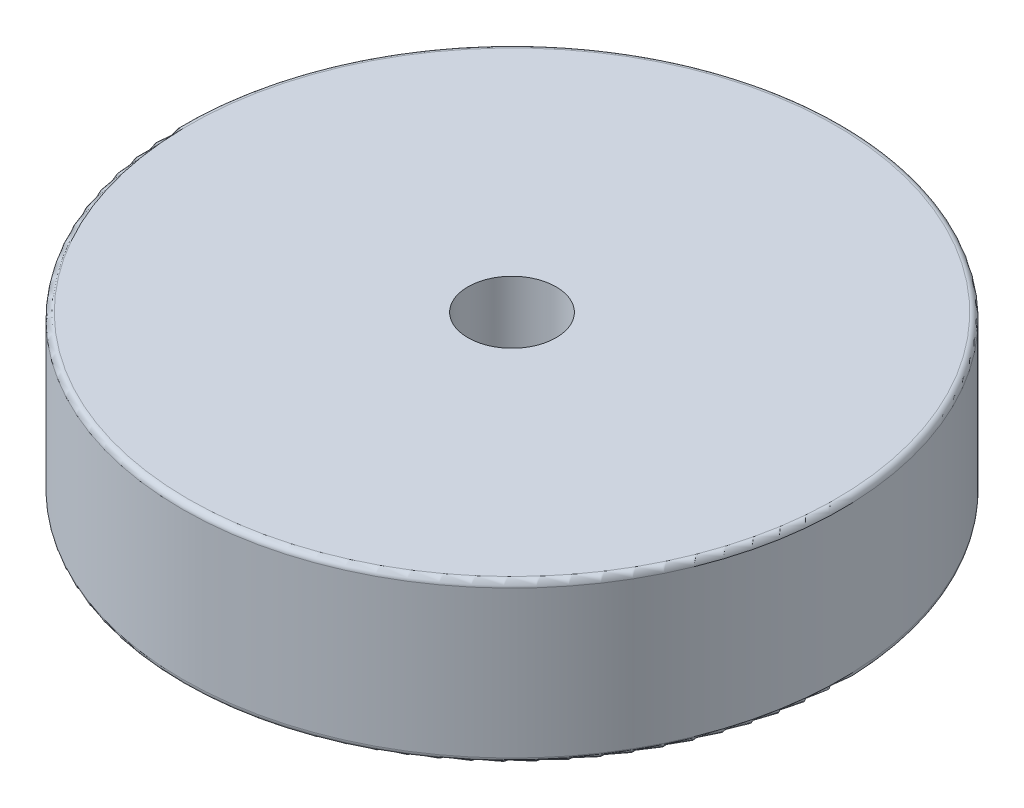
ISO-10303-21;
HEADER;
FILE_DESCRIPTION(('STEP AP214'),'2;1');
FILE_NAME('part.step','',(''),(''),'','','');
FILE_SCHEMA(('AUTOMOTIVE_DESIGN { 1 0 10303 214 1 1 1 1 }'));
ENDSEC;
DATA;
#1=APPLICATION_CONTEXT('core data for automotive mechanical design processes');
#2=APPLICATION_PROTOCOL_DEFINITION('international standard','automotive_design',2000,#1);
#3=PRODUCT_CONTEXT('',#1,'mechanical');
#4=PRODUCT('Part','Part','',(#3));
#5=PRODUCT_RELATED_PRODUCT_CATEGORY('part','',(#4));
#6=PRODUCT_DEFINITION_FORMATION('','',#4);
#7=PRODUCT_DEFINITION_CONTEXT('part definition',#1,'design');
#8=PRODUCT_DEFINITION('design','',#6,#7);
#9=PRODUCT_DEFINITION_SHAPE('','',#8);
#10=(LENGTH_UNIT() NAMED_UNIT(*) SI_UNIT(.MILLI.,.METRE.));
#11=(NAMED_UNIT(*) PLANE_ANGLE_UNIT() SI_UNIT($,.RADIAN.));
#12=(NAMED_UNIT(*) SI_UNIT($,.STERADIAN.) SOLID_ANGLE_UNIT());
#13=UNCERTAINTY_MEASURE_WITH_UNIT(LENGTH_MEASURE(1.E-05),#10,'distance_accuracy_value','');
#14=(GEOMETRIC_REPRESENTATION_CONTEXT(3) GLOBAL_UNCERTAINTY_ASSIGNED_CONTEXT((#13)) GLOBAL_UNIT_ASSIGNED_CONTEXT((#10,
#11,#12)) REPRESENTATION_CONTEXT('',''));
#15=CARTESIAN_POINT('',(0.,0.,0.));
#16=DIRECTION('',(0.,0.,1.));
#17=DIRECTION('',(1.,0.,0.));
#18=AXIS2_PLACEMENT_3D('',#15,#16,#17);
#19=CARTESIAN_POINT('',(0.,-27.,0.));
#20=DIRECTION('',(0.,1.,0.));
#21=DIRECTION('',(0.,0.,1.));
#22=AXIS2_PLACEMENT_3D('',#19,#20,#21);
#23=CYLINDRICAL_SURFACE('',#22,56.);
#24=CARTESIAN_POINT('',(0.,-26.,0.));
#25=DIRECTION('',(0.,1.,0.));
#26=DIRECTION('',(0.,0.,1.));
#27=AXIS2_PLACEMENT_3D('',#24,#25,#26);
#28=CIRCLE('',#27,56.);
#29=CARTESIAN_POINT('',(0.,-26.,56.));
#30=VERTEX_POINT('',#29);
#31=EDGE_CURVE('E44',#30,#30,#28,.T.);
#32=ORIENTED_EDGE('',*,*,#31,.T.);
#33=EDGE_LOOP('',(#32));
#34=FACE_BOUND('',#33,.T.);
#35=CARTESIAN_POINT('',(0.,-1.,0.));
#36=DIRECTION('',(0.,1.,0.));
#37=DIRECTION('',(0.,0.,1.));
#38=AXIS2_PLACEMENT_3D('',#35,#36,#37);
#39=CIRCLE('',#38,56.);
#40=CARTESIAN_POINT('',(0.,-1.,56.));
#41=VERTEX_POINT('',#40);
#42=EDGE_CURVE('E48',#41,#41,#39,.F.);
#43=ORIENTED_EDGE('',*,*,#42,.T.);
#44=EDGE_LOOP('',(#43));
#45=FACE_BOUND('',#44,.T.);
#46=ADVANCED_FACE('F33',(#34,#45),#23,.T.);
#47=CARTESIAN_POINT('',(0.,-27.,0.));
#48=DIRECTION('',(0.,1.,0.));
#49=DIRECTION('',(0.,0.,1.));
#50=AXIS2_PLACEMENT_3D('',#47,#48,#49);
#51=PLANE('',#50);
#52=CARTESIAN_POINT('',(0.,-27.,0.));
#53=DIRECTION('',(0.,1.,0.));
#54=DIRECTION('',(0.,0.,1.));
#55=AXIS2_PLACEMENT_3D('',#52,#53,#54);
#56=CIRCLE('',#55,55.);
#57=CARTESIAN_POINT('',(0.,-27.,55.));
#58=VERTEX_POINT('',#57);
#59=EDGE_CURVE('E40',#58,#58,#56,.F.);
#60=ORIENTED_EDGE('',*,*,#59,.T.);
#61=EDGE_LOOP('',(#60));
#62=FACE_BOUND('',#61,.T.);
#63=CARTESIAN_POINT('',(0.,-27.,0.));
#64=DIRECTION('',(0.,1.,0.));
#65=DIRECTION('',(0.,0.,1.));
#66=AXIS2_PLACEMENT_3D('',#63,#64,#65);
#67=CIRCLE('',#66,29.5);
#68=CARTESIAN_POINT('',(0.,-27.,29.5));
#69=VERTEX_POINT('',#68);
#70=EDGE_CURVE('E62',#69,#69,#67,.F.);
#71=ORIENTED_EDGE('',*,*,#70,.F.);
#72=EDGE_LOOP('',(#71));
#73=FACE_BOUND('',#72,.T.);
#74=ADVANCED_FACE('F74',(#62,#73),#51,.F.);
#75=CARTESIAN_POINT('',(0.,0.,0.));
#76=DIRECTION('',(0.,1.,0.));
#77=DIRECTION('',(0.,0.,1.));
#78=AXIS2_PLACEMENT_3D('',#75,#76,#77);
#79=PLANE('',#78);
#80=CARTESIAN_POINT('',(0.,0.,0.));
#81=DIRECTION('',(0.,1.,0.));
#82=DIRECTION('',(0.,0.,1.));
#83=AXIS2_PLACEMENT_3D('',#80,#81,#82);
#84=CIRCLE('',#83,55.);
#85=CARTESIAN_POINT('',(0.,0.,55.));
#86=VERTEX_POINT('',#85);
#87=EDGE_CURVE('E10',#86,#86,#84,.T.);
#88=ORIENTED_EDGE('',*,*,#87,.T.);
#89=EDGE_LOOP('',(#88));
#90=FACE_BOUND('',#89,.T.);
#91=CARTESIAN_POINT('',(0.,0.,0.));
#92=DIRECTION('',(0.,1.,0.));
#93=DIRECTION('',(0.,0.,1.));
#94=AXIS2_PLACEMENT_3D('',#91,#92,#93);
#95=CIRCLE('',#94,7.5);
#96=CARTESIAN_POINT('',(0.,0.,7.5));
#97=VERTEX_POINT('',#96);
#98=EDGE_CURVE('E65',#97,#97,#95,.T.);
#99=ORIENTED_EDGE('',*,*,#98,.F.);
#100=EDGE_LOOP('',(#99));
#101=FACE_BOUND('',#100,.T.);
#102=ADVANCED_FACE('F71',(#90,#101),#79,.T.);
#103=CARTESIAN_POINT('',(0.,-32.,0.));
#104=DIRECTION('',(0.,-1.,0.));
#105=DIRECTION('',(0.,0.,-1.));
#106=AXIS2_PLACEMENT_3D('',#103,#104,#105);
#107=PLANE('',#106);
#108=CARTESIAN_POINT('',(0.,-32.,0.));
#109=DIRECTION('',(0.,-1.,0.));
#110=DIRECTION('',(0.,0.,-1.));
#111=AXIS2_PLACEMENT_3D('',#108,#109,#110);
#112=CIRCLE('',#111,8.5);
#113=CARTESIAN_POINT('',(0.,-32.,-8.5));
#114=VERTEX_POINT('',#113);
#115=EDGE_CURVE('E53',#114,#114,#112,.F.);
#116=ORIENTED_EDGE('',*,*,#115,.T.);
#117=EDGE_LOOP('',(#116));
#118=FACE_BOUND('',#117,.T.);
#119=CARTESIAN_POINT('',(0.,-32.,0.));
#120=DIRECTION('',(0.,-1.,0.));
#121=DIRECTION('',(0.,0.,-1.));
#122=AXIS2_PLACEMENT_3D('',#119,#120,#121);
#123=CIRCLE('',#122,24.5);
#124=CARTESIAN_POINT('',(0.,-32.,-24.5));
#125=VERTEX_POINT('',#124);
#126=EDGE_CURVE('E59',#125,#125,#123,.T.);
#127=ORIENTED_EDGE('',*,*,#126,.T.);
#128=EDGE_LOOP('',(#127));
#129=FACE_BOUND('',#128,.T.);
#130=ADVANCED_FACE('F73',(#118,#129),#107,.T.);
#131=CARTESIAN_POINT('',(0.,-27.,0.));
#132=DIRECTION('',(0.,-1.,0.));
#133=DIRECTION('',(0.,0.,-1.));
#134=AXIS2_PLACEMENT_3D('',#131,#132,#133);
#135=TOROIDAL_SURFACE('',#134,24.5,5.);
#136=ORIENTED_EDGE('',*,*,#70,.T.);
#137=EDGE_LOOP('',(#136));
#138=FACE_BOUND('',#137,.T.);
#139=ORIENTED_EDGE('',*,*,#126,.F.);
#140=EDGE_LOOP('',(#139));
#141=FACE_BOUND('',#140,.T.);
#142=ADVANCED_FACE('F80',(#138,#141),#135,.T.);
#143=CARTESIAN_POINT('',(0.,1.,0.));
#144=DIRECTION('',(0.,-1.,0.));
#145=DIRECTION('',(0.,0.,-1.));
#146=AXIS2_PLACEMENT_3D('',#143,#144,#145);
#147=CYLINDRICAL_SURFACE('',#146,7.5);
#148=CARTESIAN_POINT('',(0.,-31.,0.));
#149=DIRECTION('',(0.,-1.,0.));
#150=DIRECTION('',(0.,0.,-1.));
#151=AXIS2_PLACEMENT_3D('',#148,#149,#150);
#152=CIRCLE('',#151,7.5);
#153=CARTESIAN_POINT('',(0.,-31.,-7.5));
#154=VERTEX_POINT('',#153);
#155=EDGE_CURVE('E56',#154,#154,#152,.T.);
#156=ORIENTED_EDGE('',*,*,#155,.T.);
#157=EDGE_LOOP('',(#156));
#158=FACE_BOUND('',#157,.T.);
#159=ORIENTED_EDGE('',*,*,#98,.T.);
#160=EDGE_LOOP('',(#159));
#161=FACE_BOUND('',#160,.T.);
#162=ADVANCED_FACE('F69',(#158,#161),#147,.F.);
#163=CARTESIAN_POINT('',(0.,-31.,0.));
#164=DIRECTION('',(0.,-1.,0.));
#165=DIRECTION('',(0.,0.,-1.));
#166=AXIS2_PLACEMENT_3D('',#163,#164,#165);
#167=TOROIDAL_SURFACE('',#166,8.5,1.);
#168=ORIENTED_EDGE('',*,*,#115,.F.);
#169=EDGE_LOOP('',(#168));
#170=FACE_BOUND('',#169,.T.);
#171=ORIENTED_EDGE('',*,*,#155,.F.);
#172=EDGE_LOOP('',(#171));
#173=FACE_BOUND('',#172,.T.);
#174=ADVANCED_FACE('F94',(#170,#173),#167,.T.);
#175=CARTESIAN_POINT('',(0.,-26.,0.));
#176=DIRECTION('',(0.,1.,0.));
#177=DIRECTION('',(0.,0.,1.));
#178=AXIS2_PLACEMENT_3D('',#175,#176,#177);
#179=TOROIDAL_SURFACE('',#178,55.,1.);
#180=ORIENTED_EDGE('',*,*,#59,.F.);
#181=EDGE_LOOP('',(#180));
#182=FACE_BOUND('',#181,.T.);
#183=ORIENTED_EDGE('',*,*,#31,.F.);
#184=EDGE_LOOP('',(#183));
#185=FACE_BOUND('',#184,.T.);
#186=ADVANCED_FACE('F96',(#182,#185),#179,.T.);
#187=CARTESIAN_POINT('',(0.,-1.,0.));
#188=DIRECTION('',(0.,1.,0.));
#189=DIRECTION('',(0.,0.,1.));
#190=AXIS2_PLACEMENT_3D('',#187,#188,#189);
#191=TOROIDAL_SURFACE('',#190,55.,1.);
#192=ORIENTED_EDGE('',*,*,#42,.F.);
#193=EDGE_LOOP('',(#192));
#194=FACE_BOUND('',#193,.T.);
#195=ORIENTED_EDGE('',*,*,#87,.F.);
#196=EDGE_LOOP('',(#195));
#197=FACE_BOUND('',#196,.T.);
#198=ADVANCED_FACE('F35',(#194,#197),#191,.T.);
#199=CLOSED_SHELL('',(#46,#74,#102,#130,#142,#162,#174,#186,#198));
#200=MANIFOLD_SOLID_BREP('B2',#199);
#201=ADVANCED_BREP_SHAPE_REPRESENTATION('',(#18,#200),#14);
#202=SHAPE_DEFINITION_REPRESENTATION(#9,#201);
ENDSEC;
END-ISO-10303-21;
